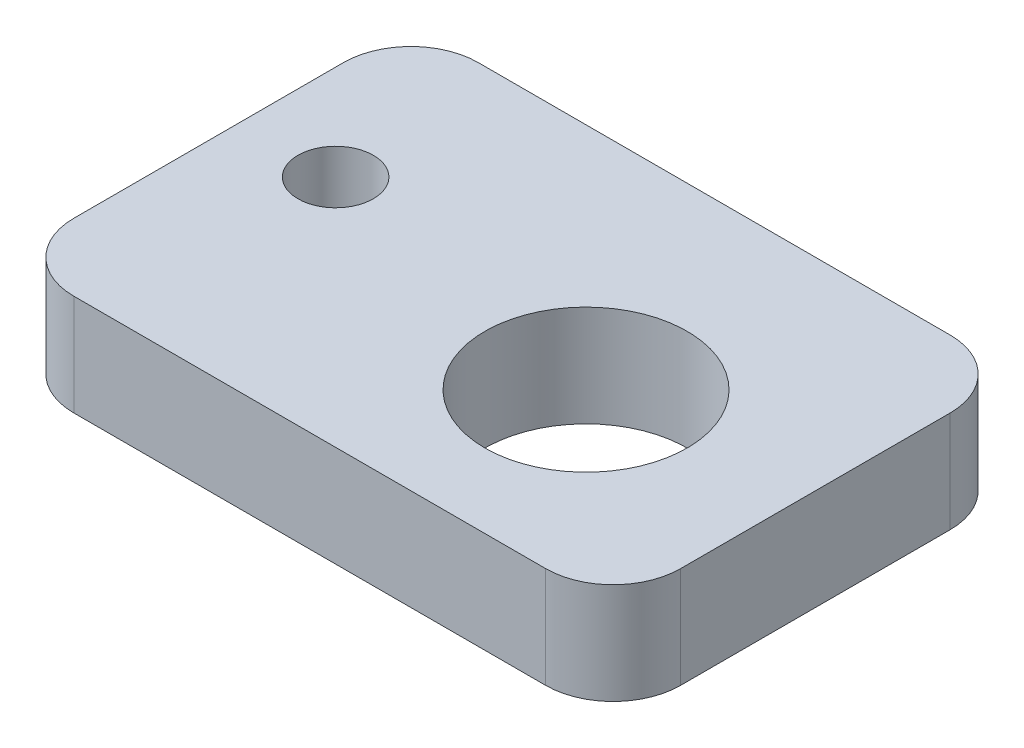
ISO-10303-21;
HEADER;
FILE_DESCRIPTION(('STEP AP214'),'2;1');
FILE_NAME('part.step','',(''),(''),'','','');
FILE_SCHEMA(('AUTOMOTIVE_DESIGN { 1 0 10303 214 1 1 1 1 }'));
ENDSEC;
DATA;
#1=APPLICATION_CONTEXT('core data for automotive mechanical design processes');
#2=APPLICATION_PROTOCOL_DEFINITION('international standard','automotive_design',2000,#1);
#3=PRODUCT_CONTEXT('',#1,'mechanical');
#4=PRODUCT('Part','Part','',(#3));
#5=PRODUCT_RELATED_PRODUCT_CATEGORY('part','',(#4));
#6=PRODUCT_DEFINITION_FORMATION('','',#4);
#7=PRODUCT_DEFINITION_CONTEXT('part definition',#1,'design');
#8=PRODUCT_DEFINITION('design','',#6,#7);
#9=PRODUCT_DEFINITION_SHAPE('','',#8);
#10=(LENGTH_UNIT() NAMED_UNIT(*) SI_UNIT(.MILLI.,.METRE.));
#11=(NAMED_UNIT(*) PLANE_ANGLE_UNIT() SI_UNIT($,.RADIAN.));
#12=(NAMED_UNIT(*) SI_UNIT($,.STERADIAN.) SOLID_ANGLE_UNIT());
#13=UNCERTAINTY_MEASURE_WITH_UNIT(LENGTH_MEASURE(1.E-05),#10,'distance_accuracy_value','');
#14=(GEOMETRIC_REPRESENTATION_CONTEXT(3) GLOBAL_UNCERTAINTY_ASSIGNED_CONTEXT((#13)) GLOBAL_UNIT_ASSIGNED_CONTEXT((#10,
#11,#12)) REPRESENTATION_CONTEXT('',''));
#15=CARTESIAN_POINT('',(0.,0.,0.));
#16=DIRECTION('',(0.,0.,1.));
#17=DIRECTION('',(1.,0.,0.));
#18=AXIS2_PLACEMENT_3D('',#15,#16,#17);
#19=CARTESIAN_POINT('',(0.,30.,-10.5148232374907));
#20=DIRECTION('',(1.,0.,0.));
#21=DIRECTION('',(0.,0.,-1.));
#22=AXIS2_PLACEMENT_3D('',#19,#20,#21);
#23=PLANE('',#22);
#24=DIRECTION('',(0.,0.,1.));
#25=VECTOR('',#24,1.);
#26=CARTESIAN_POINT('',(0.,30.,-10.5148232374907));
#27=LINE('',#26,#25);
#28=CARTESIAN_POINT('',(0.,30.,9.48517676250927));
#29=VERTEX_POINT('',#28);
#30=CARTESIAN_POINT('',(0.,30.,89.4851767625093));
#31=VERTEX_POINT('',#30);
#32=EDGE_CURVE('E189',#29,#31,#27,.T.);
#33=ORIENTED_EDGE('',*,*,#32,.F.);
#34=DIRECTION('',(0.,-1.,0.));
#35=VECTOR('',#34,1.);
#36=CARTESIAN_POINT('',(0.,30.,9.48517676250927));
#37=LINE('',#36,#35);
#38=CARTESIAN_POINT('',(0.,0.,9.48517676250927));
#39=VERTEX_POINT('',#38);
#40=EDGE_CURVE('E174',#29,#39,#37,.T.);
#41=ORIENTED_EDGE('',*,*,#40,.T.);
#42=DIRECTION('',(0.,0.,1.));
#43=VECTOR('',#42,1.);
#44=CARTESIAN_POINT('',(0.,0.,-10.5148232374907));
#45=LINE('',#44,#43);
#46=CARTESIAN_POINT('',(0.,0.,89.4851767625093));
#47=VERTEX_POINT('',#46);
#48=EDGE_CURVE('E186',#39,#47,#45,.T.);
#49=ORIENTED_EDGE('',*,*,#48,.T.);
#50=DIRECTION('',(0.,-1.,0.));
#51=VECTOR('',#50,1.);
#52=CARTESIAN_POINT('',(0.,30.,89.4851767625093));
#53=LINE('',#52,#51);
#54=EDGE_CURVE('E191',#47,#31,#53,.F.);
#55=ORIENTED_EDGE('',*,*,#54,.T.);
#56=EDGE_LOOP('',(#33,#41,#49,#55));
#57=FACE_BOUND('',#56,.T.);
#58=ADVANCED_FACE('F39',(#57),#23,.F.);
#59=CARTESIAN_POINT('',(0.,30.,109.485176762509));
#60=DIRECTION('',(0.,0.,-1.));
#61=DIRECTION('',(-1.,0.,0.));
#62=AXIS2_PLACEMENT_3D('',#59,#60,#61);
#63=PLANE('',#62);
#64=DIRECTION('',(1.,0.,0.));
#65=VECTOR('',#64,1.);
#66=CARTESIAN_POINT('',(0.,0.,109.485176762509));
#67=LINE('',#66,#65);
#68=CARTESIAN_POINT('',(20.,0.,109.485176762509));
#69=VERTEX_POINT('',#68);
#70=CARTESIAN_POINT('',(160.,0.,109.485176762509));
#71=VERTEX_POINT('',#70);
#72=EDGE_CURVE('E195',#69,#71,#67,.T.);
#73=ORIENTED_EDGE('',*,*,#72,.T.);
#74=DIRECTION('',(0.,-1.,0.));
#75=VECTOR('',#74,1.);
#76=CARTESIAN_POINT('',(160.,30.,109.485176762509));
#77=LINE('',#76,#75);
#78=CARTESIAN_POINT('',(160.,30.,109.485176762509));
#79=VERTEX_POINT('',#78);
#80=EDGE_CURVE('E233',#71,#79,#77,.F.);
#81=ORIENTED_EDGE('',*,*,#80,.T.);
#82=DIRECTION('',(1.,0.,0.));
#83=VECTOR('',#82,1.);
#84=CARTESIAN_POINT('',(0.,30.,109.485176762509));
#85=LINE('',#84,#83);
#86=CARTESIAN_POINT('',(20.,30.,109.485176762509));
#87=VERTEX_POINT('',#86);
#88=EDGE_CURVE('E398',#87,#79,#85,.T.);
#89=ORIENTED_EDGE('',*,*,#88,.F.);
#90=DIRECTION('',(0.,-1.,0.));
#91=VECTOR('',#90,1.);
#92=CARTESIAN_POINT('',(20.,30.,109.485176762509));
#93=LINE('',#92,#91);
#94=EDGE_CURVE('E230',#87,#69,#93,.T.);
#95=ORIENTED_EDGE('',*,*,#94,.T.);
#96=EDGE_LOOP('',(#73,#81,#89,#95));
#97=FACE_BOUND('',#96,.T.);
#98=ADVANCED_FACE('F359',(#97),#63,.F.);
#99=CARTESIAN_POINT('',(180.,30.,-10.5148232374907));
#100=DIRECTION('',(-1.,0.,0.));
#101=DIRECTION('',(0.,0.,1.));
#102=AXIS2_PLACEMENT_3D('',#99,#100,#101);
#103=PLANE('',#102);
#104=DIRECTION('',(0.,0.,-1.));
#105=VECTOR('',#104,1.);
#106=CARTESIAN_POINT('',(180.,0.,-10.5148232374907));
#107=LINE('',#106,#105);
#108=CARTESIAN_POINT('',(180.,0.,89.4851767625093));
#109=VERTEX_POINT('',#108);
#110=CARTESIAN_POINT('',(180.,0.,9.48517676250927));
#111=VERTEX_POINT('',#110);
#112=EDGE_CURVE('E199',#109,#111,#107,.T.);
#113=ORIENTED_EDGE('',*,*,#112,.T.);
#114=DIRECTION('',(0.,-1.,0.));
#115=VECTOR('',#114,1.);
#116=CARTESIAN_POINT('',(180.,30.,9.48517676250927));
#117=LINE('',#116,#115);
#118=CARTESIAN_POINT('',(180.,30.,9.48517676250927));
#119=VERTEX_POINT('',#118);
#120=EDGE_CURVE('E118',#111,#119,#117,.F.);
#121=ORIENTED_EDGE('',*,*,#120,.T.);
#122=DIRECTION('',(0.,0.,-1.));
#123=VECTOR('',#122,1.);
#124=CARTESIAN_POINT('',(180.,30.,-10.5148232374907));
#125=LINE('',#124,#123);
#126=CARTESIAN_POINT('',(180.,30.,89.4851767625093));
#127=VERTEX_POINT('',#126);
#128=EDGE_CURVE('E399',#127,#119,#125,.T.);
#129=ORIENTED_EDGE('',*,*,#128,.F.);
#130=DIRECTION('',(0.,-1.,0.));
#131=VECTOR('',#130,1.);
#132=CARTESIAN_POINT('',(180.,30.,89.4851767625093));
#133=LINE('',#132,#131);
#134=EDGE_CURVE('E226',#127,#109,#133,.T.);
#135=ORIENTED_EDGE('',*,*,#134,.T.);
#136=EDGE_LOOP('',(#113,#121,#129,#135));
#137=FACE_BOUND('',#136,.T.);
#138=ADVANCED_FACE('F362',(#137),#103,.F.);
#139=CARTESIAN_POINT('',(0.,30.,-10.5148232374907));
#140=DIRECTION('',(0.,0.,1.));
#141=DIRECTION('',(1.,0.,0.));
#142=AXIS2_PLACEMENT_3D('',#139,#140,#141);
#143=PLANE('',#142);
#144=DIRECTION('',(-1.,0.,0.));
#145=VECTOR('',#144,1.);
#146=CARTESIAN_POINT('',(0.,0.,-10.5148232374907));
#147=LINE('',#146,#145);
#148=CARTESIAN_POINT('',(160.,0.,-10.5148232374907));
#149=VERTEX_POINT('',#148);
#150=CARTESIAN_POINT('',(20.,0.,-10.5148232374907));
#151=VERTEX_POINT('',#150);
#152=EDGE_CURVE('E209',#149,#151,#147,.T.);
#153=ORIENTED_EDGE('',*,*,#152,.T.);
#154=DIRECTION('',(0.,-1.,0.));
#155=VECTOR('',#154,1.);
#156=CARTESIAN_POINT('',(20.,30.,-10.5148232374907));
#157=LINE('',#156,#155);
#158=CARTESIAN_POINT('',(20.,30.,-10.5148232374907));
#159=VERTEX_POINT('',#158);
#160=EDGE_CURVE('E175',#151,#159,#157,.F.);
#161=ORIENTED_EDGE('',*,*,#160,.T.);
#162=DIRECTION('',(-1.,0.,0.));
#163=VECTOR('',#162,1.);
#164=CARTESIAN_POINT('',(0.,30.,-10.5148232374907));
#165=LINE('',#164,#163);
#166=CARTESIAN_POINT('',(160.,30.,-10.5148232374907));
#167=VERTEX_POINT('',#166);
#168=EDGE_CURVE('E205',#167,#159,#165,.T.);
#169=ORIENTED_EDGE('',*,*,#168,.F.);
#170=DIRECTION('',(0.,-1.,0.));
#171=VECTOR('',#170,1.);
#172=CARTESIAN_POINT('',(160.,30.,-10.5148232374907));
#173=LINE('',#172,#171);
#174=EDGE_CURVE('E180',#167,#149,#173,.T.);
#175=ORIENTED_EDGE('',*,*,#174,.T.);
#176=EDGE_LOOP('',(#153,#161,#169,#175));
#177=FACE_BOUND('',#176,.T.);
#178=ADVANCED_FACE('F366',(#177),#143,.F.);
#179=CARTESIAN_POINT('',(0.,30.,0.));
#180=DIRECTION('',(0.,1.,0.));
#181=DIRECTION('',(0.,0.,1.));
#182=AXIS2_PLACEMENT_3D('',#179,#180,#181);
#183=PLANE('',#182);
#184=CARTESIAN_POINT('',(28.2393408076018,30.,40.0438096476705));
#185=DIRECTION('',(0.,1.,0.));
#186=DIRECTION('',(0.,0.,1.));
#187=AXIS2_PLACEMENT_3D('',#184,#185,#186);
#188=CIRCLE('',#187,11.1860389019836);
#189=CARTESIAN_POINT('',(28.2393408076018,30.,51.2298485496541));
#190=VERTEX_POINT('',#189);
#191=EDGE_CURVE('E391',#190,#190,#188,.T.);
#192=ORIENTED_EDGE('',*,*,#191,.F.);
#193=EDGE_LOOP('',(#192));
#194=FACE_BOUND('',#193,.T.);
#195=CARTESIAN_POINT('',(120.,30.,57.5236525354429));
#196=DIRECTION('',(0.,1.,0.));
#197=DIRECTION('',(0.,0.,1.));
#198=AXIS2_PLACEMENT_3D('',#195,#196,#197);
#199=CIRCLE('',#198,30.);
#200=CARTESIAN_POINT('',(120.,30.,87.5236525354429));
#201=VERTEX_POINT('',#200);
#202=EDGE_CURVE('E202',#201,#201,#199,.T.);
#203=ORIENTED_EDGE('',*,*,#202,.F.);
#204=EDGE_LOOP('',(#203));
#205=FACE_BOUND('',#204,.T.);
#206=ORIENTED_EDGE('',*,*,#168,.T.);
#207=CARTESIAN_POINT('',(20.,30.,9.48517676250927));
#208=DIRECTION('',(0.,1.,0.));
#209=DIRECTION('',(0.,0.,1.));
#210=AXIS2_PLACEMENT_3D('',#207,#208,#209);
#211=CIRCLE('',#210,20.);
#212=EDGE_CURVE('E224',#159,#29,#211,.T.);
#213=ORIENTED_EDGE('',*,*,#212,.T.);
#214=ORIENTED_EDGE('',*,*,#32,.T.);
#215=CARTESIAN_POINT('',(20.,30.,89.4851767625093));
#216=DIRECTION('',(0.,1.,0.));
#217=DIRECTION('',(0.,0.,1.));
#218=AXIS2_PLACEMENT_3D('',#215,#216,#217);
#219=CIRCLE('',#218,20.);
#220=EDGE_CURVE('E219',#31,#87,#219,.T.);
#221=ORIENTED_EDGE('',*,*,#220,.T.);
#222=ORIENTED_EDGE('',*,*,#88,.T.);
#223=CARTESIAN_POINT('',(160.,30.,89.4851767625093));
#224=DIRECTION('',(0.,1.,0.));
#225=DIRECTION('',(0.,0.,1.));
#226=AXIS2_PLACEMENT_3D('',#223,#224,#225);
#227=CIRCLE('',#226,20.);
#228=EDGE_CURVE('E125',#79,#127,#227,.T.);
#229=ORIENTED_EDGE('',*,*,#228,.T.);
#230=ORIENTED_EDGE('',*,*,#128,.T.);
#231=CARTESIAN_POINT('',(160.,30.,9.48517676250927));
#232=DIRECTION('',(0.,1.,0.));
#233=DIRECTION('',(0.,0.,1.));
#234=AXIS2_PLACEMENT_3D('',#231,#232,#233);
#235=CIRCLE('',#234,20.);
#236=EDGE_CURVE('E222',#119,#167,#235,.T.);
#237=ORIENTED_EDGE('',*,*,#236,.T.);
#238=EDGE_LOOP('',(#206,#213,#214,#221,#222,#229,#230,#237));
#239=FACE_BOUND('',#238,.T.);
#240=ADVANCED_FACE('F369',(#194,#205,#239),#183,.T.);
#241=CARTESIAN_POINT('',(0.,0.,0.));
#242=DIRECTION('',(0.,1.,0.));
#243=DIRECTION('',(0.,0.,1.));
#244=AXIS2_PLACEMENT_3D('',#241,#242,#243);
#245=PLANE('',#244);
#246=CARTESIAN_POINT('',(28.2393408076018,0.,40.0438096476705));
#247=DIRECTION('',(0.,1.,0.));
#248=DIRECTION('',(0.,0.,1.));
#249=AXIS2_PLACEMENT_3D('',#246,#247,#248);
#250=CIRCLE('',#249,11.1860389019836);
#251=CARTESIAN_POINT('',(28.2393408076018,0.,51.2298485496541));
#252=VERTEX_POINT('',#251);
#253=EDGE_CURVE('E388',#252,#252,#250,.T.);
#254=ORIENTED_EDGE('',*,*,#253,.T.);
#255=EDGE_LOOP('',(#254));
#256=FACE_BOUND('',#255,.T.);
#257=CARTESIAN_POINT('',(120.,0.,57.5236525354429));
#258=DIRECTION('',(0.,1.,0.));
#259=DIRECTION('',(0.,0.,1.));
#260=AXIS2_PLACEMENT_3D('',#257,#258,#259);
#261=CIRCLE('',#260,30.);
#262=CARTESIAN_POINT('',(120.,0.,87.5236525354429));
#263=VERTEX_POINT('',#262);
#264=EDGE_CURVE('E196',#263,#263,#261,.T.);
#265=ORIENTED_EDGE('',*,*,#264,.T.);
#266=EDGE_LOOP('',(#265));
#267=FACE_BOUND('',#266,.T.);
#268=ORIENTED_EDGE('',*,*,#48,.F.);
#269=CARTESIAN_POINT('',(20.,0.,9.48517676250927));
#270=DIRECTION('',(0.,1.,0.));
#271=DIRECTION('',(0.,0.,1.));
#272=AXIS2_PLACEMENT_3D('',#269,#270,#271);
#273=CIRCLE('',#272,20.);
#274=EDGE_CURVE('E170',#39,#151,#273,.F.);
#275=ORIENTED_EDGE('',*,*,#274,.T.);
#276=ORIENTED_EDGE('',*,*,#152,.F.);
#277=CARTESIAN_POINT('',(160.,0.,9.48517676250927));
#278=DIRECTION('',(0.,1.,0.));
#279=DIRECTION('',(0.,0.,1.));
#280=AXIS2_PLACEMENT_3D('',#277,#278,#279);
#281=CIRCLE('',#280,20.);
#282=EDGE_CURVE('E181',#149,#111,#281,.F.);
#283=ORIENTED_EDGE('',*,*,#282,.T.);
#284=ORIENTED_EDGE('',*,*,#112,.F.);
#285=CARTESIAN_POINT('',(160.,0.,89.4851767625093));
#286=DIRECTION('',(0.,1.,0.));
#287=DIRECTION('',(0.,0.,1.));
#288=AXIS2_PLACEMENT_3D('',#285,#286,#287);
#289=CIRCLE('',#288,20.);
#290=EDGE_CURVE('E213',#109,#71,#289,.F.);
#291=ORIENTED_EDGE('',*,*,#290,.T.);
#292=ORIENTED_EDGE('',*,*,#72,.F.);
#293=CARTESIAN_POINT('',(20.,0.,89.4851767625093));
#294=DIRECTION('',(0.,1.,0.));
#295=DIRECTION('',(0.,0.,1.));
#296=AXIS2_PLACEMENT_3D('',#293,#294,#295);
#297=CIRCLE('',#296,20.);
#298=EDGE_CURVE('E190',#69,#47,#297,.F.);
#299=ORIENTED_EDGE('',*,*,#298,.T.);
#300=EDGE_LOOP('',(#268,#275,#276,#283,#284,#291,#292,#299));
#301=FACE_BOUND('',#300,.T.);
#302=ADVANCED_FACE('F193',(#256,#267,#301),#245,.F.);
#303=CARTESIAN_POINT('',(120.,0.,57.5236525354429));
#304=DIRECTION('',(0.,1.,0.));
#305=DIRECTION('',(0.,0.,1.));
#306=AXIS2_PLACEMENT_3D('',#303,#304,#305);
#307=CYLINDRICAL_SURFACE('',#306,30.);
#308=ORIENTED_EDGE('',*,*,#264,.F.);
#309=EDGE_LOOP('',(#308));
#310=FACE_BOUND('',#309,.T.);
#311=ORIENTED_EDGE('',*,*,#202,.T.);
#312=EDGE_LOOP('',(#311));
#313=FACE_BOUND('',#312,.T.);
#314=ADVANCED_FACE('F373',(#310,#313),#307,.F.);
#315=CARTESIAN_POINT('',(28.2393408076018,0.,40.0438096476705));
#316=DIRECTION('',(0.,1.,0.));
#317=DIRECTION('',(0.,0.,1.));
#318=AXIS2_PLACEMENT_3D('',#315,#316,#317);
#319=CYLINDRICAL_SURFACE('',#318,11.1860389019836);
#320=ORIENTED_EDGE('',*,*,#253,.F.);
#321=EDGE_LOOP('',(#320));
#322=FACE_BOUND('',#321,.T.);
#323=ORIENTED_EDGE('',*,*,#191,.T.);
#324=EDGE_LOOP('',(#323));
#325=FACE_BOUND('',#324,.T.);
#326=ADVANCED_FACE('F356',(#322,#325),#319,.F.);
#327=CARTESIAN_POINT('',(20.,30.,9.48517676250927));
#328=DIRECTION('',(0.,-1.,0.));
#329=DIRECTION('',(0.,0.,-1.));
#330=AXIS2_PLACEMENT_3D('',#327,#328,#329);
#331=CYLINDRICAL_SURFACE('',#330,20.);
#332=ORIENTED_EDGE('',*,*,#212,.F.);
#333=ORIENTED_EDGE('',*,*,#160,.F.);
#334=ORIENTED_EDGE('',*,*,#274,.F.);
#335=ORIENTED_EDGE('',*,*,#40,.F.);
#336=EDGE_LOOP('',(#332,#333,#334,#335));
#337=FACE_BOUND('',#336,.T.);
#338=ADVANCED_FACE('F173',(#337),#331,.T.);
#339=CARTESIAN_POINT('',(160.,30.,9.48517676250927));
#340=DIRECTION('',(0.,-1.,0.));
#341=DIRECTION('',(0.,0.,-1.));
#342=AXIS2_PLACEMENT_3D('',#339,#340,#341);
#343=CYLINDRICAL_SURFACE('',#342,20.);
#344=ORIENTED_EDGE('',*,*,#236,.F.);
#345=ORIENTED_EDGE('',*,*,#120,.F.);
#346=ORIENTED_EDGE('',*,*,#282,.F.);
#347=ORIENTED_EDGE('',*,*,#174,.F.);
#348=EDGE_LOOP('',(#344,#345,#346,#347));
#349=FACE_BOUND('',#348,.T.);
#350=ADVANCED_FACE('F349',(#349),#343,.T.);
#351=CARTESIAN_POINT('',(160.,30.,89.4851767625093));
#352=DIRECTION('',(0.,-1.,0.));
#353=DIRECTION('',(0.,0.,-1.));
#354=AXIS2_PLACEMENT_3D('',#351,#352,#353);
#355=CYLINDRICAL_SURFACE('',#354,20.);
#356=ORIENTED_EDGE('',*,*,#228,.F.);
#357=ORIENTED_EDGE('',*,*,#80,.F.);
#358=ORIENTED_EDGE('',*,*,#290,.F.);
#359=ORIENTED_EDGE('',*,*,#134,.F.);
#360=EDGE_LOOP('',(#356,#357,#358,#359));
#361=FACE_BOUND('',#360,.T.);
#362=ADVANCED_FACE('F345',(#361),#355,.T.);
#363=CARTESIAN_POINT('',(20.,30.,89.4851767625093));
#364=DIRECTION('',(0.,-1.,0.));
#365=DIRECTION('',(0.,0.,-1.));
#366=AXIS2_PLACEMENT_3D('',#363,#364,#365);
#367=CYLINDRICAL_SURFACE('',#366,20.);
#368=ORIENTED_EDGE('',*,*,#220,.F.);
#369=ORIENTED_EDGE('',*,*,#54,.F.);
#370=ORIENTED_EDGE('',*,*,#298,.F.);
#371=ORIENTED_EDGE('',*,*,#94,.F.);
#372=EDGE_LOOP('',(#368,#369,#370,#371));
#373=FACE_BOUND('',#372,.T.);
#374=ADVANCED_FACE('F343',(#373),#367,.T.);
#375=CLOSED_SHELL('',(#58,#98,#138,#178,#240,#302,#314,#326,#338,#350,#362,#374));
#376=CARTESIAN_POINT('',(1.99999999999999,30.,-10.5148232374907));
#377=DIRECTION('',(1.,0.,0.));
#378=DIRECTION('',(0.,0.,-1.));
#379=AXIS2_PLACEMENT_3D('',#376,#377,#378);
#380=PLANE('',#379);
#381=DIRECTION('',(0.,0.,1.));
#382=VECTOR('',#381,1.);
#383=CARTESIAN_POINT('',(1.99999999999999,28.,-10.5148232374907));
#384=LINE('',#383,#382);
#385=CARTESIAN_POINT('',(1.99999999999999,28.,9.48517676250927));
#386=VERTEX_POINT('',#385);
#387=CARTESIAN_POINT('',(2.,28.,89.4851767625093));
#388=VERTEX_POINT('',#387);
#389=EDGE_CURVE('E261',#386,#388,#384,.T.);
#390=ORIENTED_EDGE('',*,*,#389,.T.);
#391=DIRECTION('',(0.,1.,0.));
#392=VECTOR('',#391,1.);
#393=CARTESIAN_POINT('',(2.,30.,89.4851767625093));
#394=LINE('',#393,#392);
#395=CARTESIAN_POINT('',(2.,2.,89.4851767625093));
#396=VERTEX_POINT('',#395);
#397=EDGE_CURVE('E110',#396,#388,#394,.T.);
#398=ORIENTED_EDGE('',*,*,#397,.F.);
#399=DIRECTION('',(0.,0.,1.));
#400=VECTOR('',#399,1.);
#401=CARTESIAN_POINT('',(1.99999999999999,2.,-10.5148232374907));
#402=LINE('',#401,#400);
#403=CARTESIAN_POINT('',(1.99999999999999,2.,9.48517676250927));
#404=VERTEX_POINT('',#403);
#405=EDGE_CURVE('E289',#404,#396,#402,.T.);
#406=ORIENTED_EDGE('',*,*,#405,.F.);
#407=DIRECTION('',(0.,1.,0.));
#408=VECTOR('',#407,1.);
#409=CARTESIAN_POINT('',(1.99999999999999,30.,9.48517676250927));
#410=LINE('',#409,#408);
#411=EDGE_CURVE('E43',#386,#404,#410,.F.);
#412=ORIENTED_EDGE('',*,*,#411,.F.);
#413=EDGE_LOOP('',(#390,#398,#406,#412));
#414=FACE_BOUND('',#413,.T.);
#415=ADVANCED_FACE('F298',(#414),#380,.T.);
#416=CARTESIAN_POINT('',(0.,30.,107.485176762509));
#417=DIRECTION('',(0.,0.,-1.));
#418=DIRECTION('',(-1.,0.,0.));
#419=AXIS2_PLACEMENT_3D('',#416,#417,#418);
#420=PLANE('',#419);
#421=DIRECTION('',(1.,0.,0.));
#422=VECTOR('',#421,1.);
#423=CARTESIAN_POINT('',(0.,2.,107.485176762509));
#424=LINE('',#423,#422);
#425=CARTESIAN_POINT('',(20.,2.,107.485176762509));
#426=VERTEX_POINT('',#425);
#427=CARTESIAN_POINT('',(160.,2.,107.485176762509));
#428=VERTEX_POINT('',#427);
#429=EDGE_CURVE('E287',#426,#428,#424,.T.);
#430=ORIENTED_EDGE('',*,*,#429,.F.);
#431=DIRECTION('',(0.,1.,0.));
#432=VECTOR('',#431,1.);
#433=CARTESIAN_POINT('',(20.,30.,107.485176762509));
#434=LINE('',#433,#432);
#435=CARTESIAN_POINT('',(20.,28.,107.485176762509));
#436=VERTEX_POINT('',#435);
#437=EDGE_CURVE('E284',#436,#426,#434,.F.);
#438=ORIENTED_EDGE('',*,*,#437,.F.);
#439=DIRECTION('',(1.,0.,0.));
#440=VECTOR('',#439,1.);
#441=CARTESIAN_POINT('',(0.,28.,107.485176762509));
#442=LINE('',#441,#440);
#443=CARTESIAN_POINT('',(160.,28.,107.485176762509));
#444=VERTEX_POINT('',#443);
#445=EDGE_CURVE('E257',#436,#444,#442,.T.);
#446=ORIENTED_EDGE('',*,*,#445,.T.);
#447=DIRECTION('',(0.,1.,0.));
#448=VECTOR('',#447,1.);
#449=CARTESIAN_POINT('',(160.,30.,107.485176762509));
#450=LINE('',#449,#448);
#451=EDGE_CURVE('E105',#428,#444,#450,.T.);
#452=ORIENTED_EDGE('',*,*,#451,.F.);
#453=EDGE_LOOP('',(#430,#438,#446,#452));
#454=FACE_BOUND('',#453,.T.);
#455=ADVANCED_FACE('F308',(#454),#420,.T.);
#456=CARTESIAN_POINT('',(178.,30.,-10.5148232374907));
#457=DIRECTION('',(-1.,0.,0.));
#458=DIRECTION('',(0.,0.,1.));
#459=AXIS2_PLACEMENT_3D('',#456,#457,#458);
#460=PLANE('',#459);
#461=DIRECTION('',(0.,0.,-1.));
#462=VECTOR('',#461,1.);
#463=CARTESIAN_POINT('',(178.,2.,-10.5148232374907));
#464=LINE('',#463,#462);
#465=CARTESIAN_POINT('',(178.,2.,89.4851767625093));
#466=VERTEX_POINT('',#465);
#467=CARTESIAN_POINT('',(178.,2.,9.48517676250927));
#468=VERTEX_POINT('',#467);
#469=EDGE_CURVE('E281',#466,#468,#464,.T.);
#470=ORIENTED_EDGE('',*,*,#469,.F.);
#471=DIRECTION('',(0.,1.,0.));
#472=VECTOR('',#471,1.);
#473=CARTESIAN_POINT('',(178.,30.,89.4851767625093));
#474=LINE('',#473,#472);
#475=CARTESIAN_POINT('',(178.,28.,89.4851767625093));
#476=VERTEX_POINT('',#475);
#477=EDGE_CURVE('E276',#476,#466,#474,.F.);
#478=ORIENTED_EDGE('',*,*,#477,.F.);
#479=DIRECTION('',(0.,0.,-1.));
#480=VECTOR('',#479,1.);
#481=CARTESIAN_POINT('',(178.,28.,-10.5148232374907));
#482=LINE('',#481,#480);
#483=CARTESIAN_POINT('',(178.,28.,9.48517676250927));
#484=VERTEX_POINT('',#483);
#485=EDGE_CURVE('E252',#476,#484,#482,.T.);
#486=ORIENTED_EDGE('',*,*,#485,.T.);
#487=DIRECTION('',(0.,1.,0.));
#488=VECTOR('',#487,1.);
#489=CARTESIAN_POINT('',(178.,30.,9.48517676250927));
#490=LINE('',#489,#488);
#491=EDGE_CURVE('E279',#468,#484,#490,.T.);
#492=ORIENTED_EDGE('',*,*,#491,.F.);
#493=EDGE_LOOP('',(#470,#478,#486,#492));
#494=FACE_BOUND('',#493,.T.);
#495=ADVANCED_FACE('F316',(#494),#460,.T.);
#496=CARTESIAN_POINT('',(0.,30.,-8.51482323749073));
#497=DIRECTION('',(0.,0.,1.));
#498=DIRECTION('',(1.,0.,0.));
#499=AXIS2_PLACEMENT_3D('',#496,#497,#498);
#500=PLANE('',#499);
#501=DIRECTION('',(-1.,0.,0.));
#502=VECTOR('',#501,1.);
#503=CARTESIAN_POINT('',(0.,2.,-8.51482323749073));
#504=LINE('',#503,#502);
#505=CARTESIAN_POINT('',(160.,2.,-8.51482323749073));
#506=VERTEX_POINT('',#505);
#507=CARTESIAN_POINT('',(20.,2.,-8.51482323749073));
#508=VERTEX_POINT('',#507);
#509=EDGE_CURVE('E273',#506,#508,#504,.T.);
#510=ORIENTED_EDGE('',*,*,#509,.F.);
#511=DIRECTION('',(0.,1.,0.));
#512=VECTOR('',#511,1.);
#513=CARTESIAN_POINT('',(160.,30.,-8.51482323749073));
#514=LINE('',#513,#512);
#515=CARTESIAN_POINT('',(160.,28.,-8.51482323749073));
#516=VERTEX_POINT('',#515);
#517=EDGE_CURVE('E268',#516,#506,#514,.F.);
#518=ORIENTED_EDGE('',*,*,#517,.F.);
#519=DIRECTION('',(-1.,0.,0.));
#520=VECTOR('',#519,1.);
#521=CARTESIAN_POINT('',(0.,28.,-8.51482323749073));
#522=LINE('',#521,#520);
#523=CARTESIAN_POINT('',(20.,28.,-8.51482323749073));
#524=VERTEX_POINT('',#523);
#525=EDGE_CURVE('E265',#516,#524,#522,.T.);
#526=ORIENTED_EDGE('',*,*,#525,.T.);
#527=DIRECTION('',(0.,1.,0.));
#528=VECTOR('',#527,1.);
#529=CARTESIAN_POINT('',(20.,30.,-8.51482323749073));
#530=LINE('',#529,#528);
#531=EDGE_CURVE('E271',#508,#524,#530,.T.);
#532=ORIENTED_EDGE('',*,*,#531,.F.);
#533=EDGE_LOOP('',(#510,#518,#526,#532));
#534=FACE_BOUND('',#533,.T.);
#535=ADVANCED_FACE('F324',(#534),#500,.T.);
#536=CARTESIAN_POINT('',(0.,28.,0.));
#537=DIRECTION('',(0.,1.,0.));
#538=DIRECTION('',(0.,0.,1.));
#539=AXIS2_PLACEMENT_3D('',#536,#537,#538);
#540=PLANE('',#539);
#541=CARTESIAN_POINT('',(28.2393408076018,28.,40.0438096476705));
#542=DIRECTION('',(0.,1.,0.));
#543=DIRECTION('',(0.,0.,1.));
#544=AXIS2_PLACEMENT_3D('',#541,#542,#543);
#545=CIRCLE('',#544,13.1860389019836);
#546=CARTESIAN_POINT('',(28.2393408076018,28.,53.2298485496541));
#547=VERTEX_POINT('',#546);
#548=EDGE_CURVE('E11',#547,#547,#545,.T.);
#549=ORIENTED_EDGE('',*,*,#548,.T.);
#550=EDGE_LOOP('',(#549));
#551=FACE_BOUND('',#550,.T.);
#552=CARTESIAN_POINT('',(120.,28.,57.5236525354429));
#553=DIRECTION('',(0.,1.,0.));
#554=DIRECTION('',(0.,0.,1.));
#555=AXIS2_PLACEMENT_3D('',#552,#553,#554);
#556=CIRCLE('',#555,32.);
#557=CARTESIAN_POINT('',(120.,28.,89.5236525354429));
#558=VERTEX_POINT('',#557);
#559=EDGE_CURVE('E50',#558,#558,#556,.T.);
#560=ORIENTED_EDGE('',*,*,#559,.T.);
#561=EDGE_LOOP('',(#560));
#562=FACE_BOUND('',#561,.T.);
#563=ORIENTED_EDGE('',*,*,#525,.F.);
#564=CARTESIAN_POINT('',(160.,28.,9.48517676250927));
#565=DIRECTION('',(0.,1.,0.));
#566=DIRECTION('',(0.,0.,1.));
#567=AXIS2_PLACEMENT_3D('',#564,#565,#566);
#568=CIRCLE('',#567,18.);
#569=EDGE_CURVE('E250',#484,#516,#568,.T.);
#570=ORIENTED_EDGE('',*,*,#569,.F.);
#571=ORIENTED_EDGE('',*,*,#485,.F.);
#572=CARTESIAN_POINT('',(160.,28.,89.4851767625093));
#573=DIRECTION('',(0.,1.,0.));
#574=DIRECTION('',(0.,0.,1.));
#575=AXIS2_PLACEMENT_3D('',#572,#573,#574);
#576=CIRCLE('',#575,18.);
#577=EDGE_CURVE('E255',#444,#476,#576,.T.);
#578=ORIENTED_EDGE('',*,*,#577,.F.);
#579=ORIENTED_EDGE('',*,*,#445,.F.);
#580=CARTESIAN_POINT('',(20.,28.,89.4851767625093));
#581=DIRECTION('',(0.,1.,0.));
#582=DIRECTION('',(0.,0.,1.));
#583=AXIS2_PLACEMENT_3D('',#580,#581,#582);
#584=CIRCLE('',#583,18.);
#585=EDGE_CURVE('E259',#388,#436,#584,.T.);
#586=ORIENTED_EDGE('',*,*,#585,.F.);
#587=ORIENTED_EDGE('',*,*,#389,.F.);
#588=CARTESIAN_POINT('',(20.,28.,9.48517676250927));
#589=DIRECTION('',(0.,1.,0.));
#590=DIRECTION('',(0.,0.,1.));
#591=AXIS2_PLACEMENT_3D('',#588,#589,#590);
#592=CIRCLE('',#591,18.);
#593=EDGE_CURVE('E263',#524,#386,#592,.T.);
#594=ORIENTED_EDGE('',*,*,#593,.F.);
#595=EDGE_LOOP('',(#563,#570,#571,#578,#579,#586,#587,#594));
#596=FACE_BOUND('',#595,.T.);
#597=ADVANCED_FACE('F303',(#551,#562,#596),#540,.F.);
#598=CARTESIAN_POINT('',(0.,2.,0.));
#599=DIRECTION('',(0.,1.,0.));
#600=DIRECTION('',(0.,0.,1.));
#601=AXIS2_PLACEMENT_3D('',#598,#599,#600);
#602=PLANE('',#601);
#603=CARTESIAN_POINT('',(28.2393408076018,2.,40.0438096476705));
#604=DIRECTION('',(0.,1.,0.));
#605=DIRECTION('',(0.,0.,1.));
#606=AXIS2_PLACEMENT_3D('',#603,#604,#605);
#607=CIRCLE('',#606,13.1860389019836);
#608=CARTESIAN_POINT('',(28.2393408076018,2.,53.2298485496541));
#609=VERTEX_POINT('',#608);
#610=EDGE_CURVE('E247',#609,#609,#607,.T.);
#611=ORIENTED_EDGE('',*,*,#610,.F.);
#612=EDGE_LOOP('',(#611));
#613=FACE_BOUND('',#612,.T.);
#614=CARTESIAN_POINT('',(120.,2.,57.5236525354429));
#615=DIRECTION('',(0.,1.,0.));
#616=DIRECTION('',(0.,0.,1.));
#617=AXIS2_PLACEMENT_3D('',#614,#615,#616);
#618=CIRCLE('',#617,32.);
#619=CARTESIAN_POINT('',(120.,2.,89.5236525354429));
#620=VERTEX_POINT('',#619);
#621=EDGE_CURVE('E244',#620,#620,#618,.T.);
#622=ORIENTED_EDGE('',*,*,#621,.F.);
#623=EDGE_LOOP('',(#622));
#624=FACE_BOUND('',#623,.T.);
#625=ORIENTED_EDGE('',*,*,#405,.T.);
#626=CARTESIAN_POINT('',(20.,2.,89.4851767625093));
#627=DIRECTION('',(0.,1.,0.));
#628=DIRECTION('',(0.,0.,1.));
#629=AXIS2_PLACEMENT_3D('',#626,#627,#628);
#630=CIRCLE('',#629,18.);
#631=EDGE_CURVE('E59',#426,#396,#630,.F.);
#632=ORIENTED_EDGE('',*,*,#631,.F.);
#633=ORIENTED_EDGE('',*,*,#429,.T.);
#634=CARTESIAN_POINT('',(160.,2.,89.4851767625093));
#635=DIRECTION('',(0.,1.,0.));
#636=DIRECTION('',(0.,0.,1.));
#637=AXIS2_PLACEMENT_3D('',#634,#635,#636);
#638=CIRCLE('',#637,18.);
#639=EDGE_CURVE('E238',#466,#428,#638,.F.);
#640=ORIENTED_EDGE('',*,*,#639,.F.);
#641=ORIENTED_EDGE('',*,*,#469,.T.);
#642=CARTESIAN_POINT('',(160.,2.,9.48517676250927));
#643=DIRECTION('',(0.,1.,0.));
#644=DIRECTION('',(0.,0.,1.));
#645=AXIS2_PLACEMENT_3D('',#642,#643,#644);
#646=CIRCLE('',#645,18.);
#647=EDGE_CURVE('E240',#506,#468,#646,.F.);
#648=ORIENTED_EDGE('',*,*,#647,.F.);
#649=ORIENTED_EDGE('',*,*,#509,.T.);
#650=CARTESIAN_POINT('',(20.,2.,9.48517676250927));
#651=DIRECTION('',(0.,1.,0.));
#652=DIRECTION('',(0.,0.,1.));
#653=AXIS2_PLACEMENT_3D('',#650,#651,#652);
#654=CIRCLE('',#653,18.);
#655=EDGE_CURVE('E242',#404,#508,#654,.F.);
#656=ORIENTED_EDGE('',*,*,#655,.F.);
#657=EDGE_LOOP('',(#625,#632,#633,#640,#641,#648,#649,#656));
#658=FACE_BOUND('',#657,.T.);
#659=ADVANCED_FACE('F309',(#613,#624,#658),#602,.T.);
#660=CARTESIAN_POINT('',(120.,0.,57.5236525354429));
#661=DIRECTION('',(0.,1.,0.));
#662=DIRECTION('',(0.,0.,1.));
#663=AXIS2_PLACEMENT_3D('',#660,#661,#662);
#664=CYLINDRICAL_SURFACE('',#663,32.);
#665=ORIENTED_EDGE('',*,*,#621,.T.);
#666=EDGE_LOOP('',(#665));
#667=FACE_BOUND('',#666,.T.);
#668=ORIENTED_EDGE('',*,*,#559,.F.);
#669=EDGE_LOOP('',(#668));
#670=FACE_BOUND('',#669,.T.);
#671=ADVANCED_FACE('F470',(#667,#670),#664,.T.);
#672=CARTESIAN_POINT('',(28.2393408076018,0.,40.0438096476705));
#673=DIRECTION('',(0.,1.,0.));
#674=DIRECTION('',(0.,0.,1.));
#675=AXIS2_PLACEMENT_3D('',#672,#673,#674);
#676=CYLINDRICAL_SURFACE('',#675,13.1860389019836);
#677=ORIENTED_EDGE('',*,*,#610,.T.);
#678=EDGE_LOOP('',(#677));
#679=FACE_BOUND('',#678,.T.);
#680=ORIENTED_EDGE('',*,*,#548,.F.);
#681=EDGE_LOOP('',(#680));
#682=FACE_BOUND('',#681,.T.);
#683=ADVANCED_FACE('F480',(#679,#682),#676,.T.);
#684=CARTESIAN_POINT('',(20.,30.,9.48517676250927));
#685=DIRECTION('',(0.,-1.,0.));
#686=DIRECTION('',(0.,0.,-1.));
#687=AXIS2_PLACEMENT_3D('',#684,#685,#686);
#688=CYLINDRICAL_SURFACE('',#687,18.);
#689=ORIENTED_EDGE('',*,*,#593,.T.);
#690=ORIENTED_EDGE('',*,*,#411,.T.);
#691=ORIENTED_EDGE('',*,*,#655,.T.);
#692=ORIENTED_EDGE('',*,*,#531,.T.);
#693=EDGE_LOOP('',(#689,#690,#691,#692));
#694=FACE_BOUND('',#693,.T.);
#695=ADVANCED_FACE('F294',(#694),#688,.F.);
#696=CARTESIAN_POINT('',(160.,30.,9.48517676250927));
#697=DIRECTION('',(0.,-1.,0.));
#698=DIRECTION('',(0.,0.,-1.));
#699=AXIS2_PLACEMENT_3D('',#696,#697,#698);
#700=CYLINDRICAL_SURFACE('',#699,18.);
#701=ORIENTED_EDGE('',*,*,#569,.T.);
#702=ORIENTED_EDGE('',*,*,#517,.T.);
#703=ORIENTED_EDGE('',*,*,#647,.T.);
#704=ORIENTED_EDGE('',*,*,#491,.T.);
#705=EDGE_LOOP('',(#701,#702,#703,#704));
#706=FACE_BOUND('',#705,.T.);
#707=ADVANCED_FACE('F319',(#706),#700,.F.);
#708=CARTESIAN_POINT('',(160.,30.,89.4851767625093));
#709=DIRECTION('',(0.,-1.,0.));
#710=DIRECTION('',(0.,0.,-1.));
#711=AXIS2_PLACEMENT_3D('',#708,#709,#710);
#712=CYLINDRICAL_SURFACE('',#711,18.);
#713=ORIENTED_EDGE('',*,*,#577,.T.);
#714=ORIENTED_EDGE('',*,*,#477,.T.);
#715=ORIENTED_EDGE('',*,*,#639,.T.);
#716=ORIENTED_EDGE('',*,*,#451,.T.);
#717=EDGE_LOOP('',(#713,#714,#715,#716));
#718=FACE_BOUND('',#717,.T.);
#719=ADVANCED_FACE('F313',(#718),#712,.F.);
#720=CARTESIAN_POINT('',(20.,30.,89.4851767625093));
#721=DIRECTION('',(0.,-1.,0.));
#722=DIRECTION('',(0.,0.,-1.));
#723=AXIS2_PLACEMENT_3D('',#720,#721,#722);
#724=CYLINDRICAL_SURFACE('',#723,18.);
#725=ORIENTED_EDGE('',*,*,#585,.T.);
#726=ORIENTED_EDGE('',*,*,#437,.T.);
#727=ORIENTED_EDGE('',*,*,#631,.T.);
#728=ORIENTED_EDGE('',*,*,#397,.T.);
#729=EDGE_LOOP('',(#725,#726,#727,#728));
#730=FACE_BOUND('',#729,.T.);
#731=ADVANCED_FACE('F41',(#730),#724,.F.);
#732=CLOSED_SHELL('',(#415,#455,#495,#535,#597,#659,#671,#683,#695,#707,#719,#731));
#733=ORIENTED_CLOSED_SHELL('',*,#732,.T.);
#734=BREP_WITH_VOIDS('B2',#375,(#733));
#735=ADVANCED_BREP_SHAPE_REPRESENTATION('',(#18,#734),#14);
#736=SHAPE_DEFINITION_REPRESENTATION(#9,#735);
ENDSEC;
END-ISO-10303-21;
